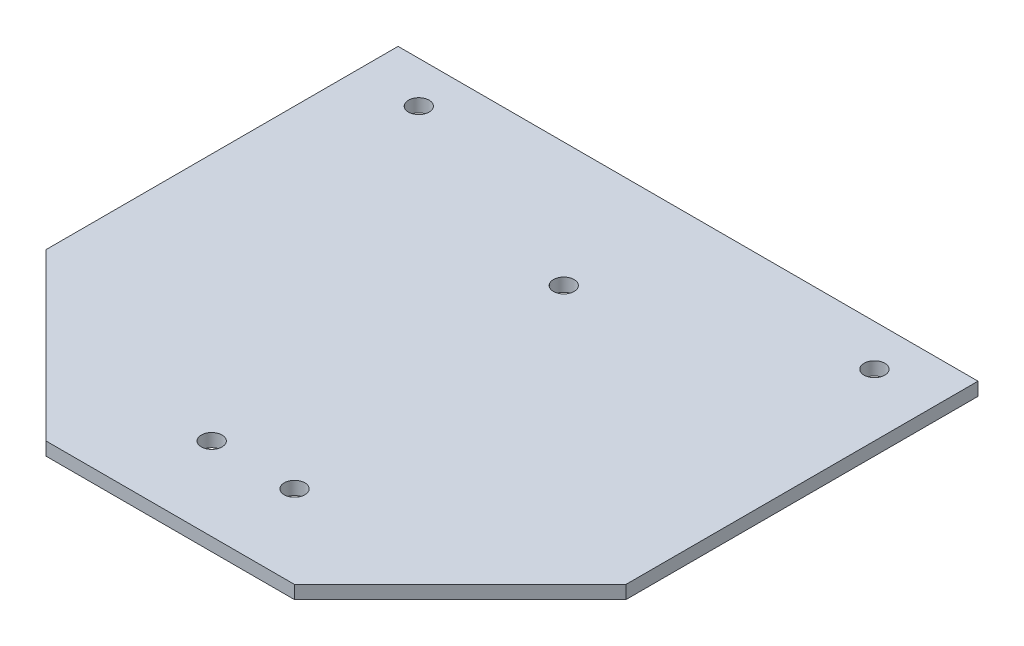
ISO-10303-21;
HEADER;
FILE_DESCRIPTION(('STEP AP214'),'2;1');
FILE_NAME('part.step','',(''),(''),'','','');
FILE_SCHEMA(('AUTOMOTIVE_DESIGN { 1 0 10303 214 1 1 1 1 }'));
ENDSEC;
DATA;
#1=APPLICATION_CONTEXT('core data for automotive mechanical design processes');
#2=APPLICATION_PROTOCOL_DEFINITION('international standard','automotive_design',2000,#1);
#3=PRODUCT_CONTEXT('',#1,'mechanical');
#4=PRODUCT('Part','Part','',(#3));
#5=PRODUCT_RELATED_PRODUCT_CATEGORY('part','',(#4));
#6=PRODUCT_DEFINITION_FORMATION('','',#4);
#7=PRODUCT_DEFINITION_CONTEXT('part definition',#1,'design');
#8=PRODUCT_DEFINITION('design','',#6,#7);
#9=PRODUCT_DEFINITION_SHAPE('','',#8);
#10=(LENGTH_UNIT() NAMED_UNIT(*) SI_UNIT(.MILLI.,.METRE.));
#11=(NAMED_UNIT(*) PLANE_ANGLE_UNIT() SI_UNIT($,.RADIAN.));
#12=(NAMED_UNIT(*) SI_UNIT($,.STERADIAN.) SOLID_ANGLE_UNIT());
#13=UNCERTAINTY_MEASURE_WITH_UNIT(LENGTH_MEASURE(1.E-05),#10,'distance_accuracy_value','');
#14=(GEOMETRIC_REPRESENTATION_CONTEXT(3) GLOBAL_UNCERTAINTY_ASSIGNED_CONTEXT((#13)) GLOBAL_UNIT_ASSIGNED_CONTEXT((#10,
#11,#12)) REPRESENTATION_CONTEXT('',''));
#15=CARTESIAN_POINT('',(0.,0.,0.));
#16=DIRECTION('',(0.,0.,1.));
#17=DIRECTION('',(1.,0.,0.));
#18=AXIS2_PLACEMENT_3D('',#15,#16,#17);
#19=CARTESIAN_POINT('',(0.,3.18,0.));
#20=DIRECTION('',(0.,-1.,0.));
#21=DIRECTION('',(0.,0.,-1.));
#22=AXIS2_PLACEMENT_3D('',#19,#20,#21);
#23=PLANE('',#22);
#24=CARTESIAN_POINT('',(10.,3.18,-20.));
#25=DIRECTION('',(0.,1.,0.));
#26=DIRECTION('',(0.,0.,1.));
#27=AXIS2_PLACEMENT_3D('',#24,#25,#26);
#28=CIRCLE('',#27,2.5);
#29=CARTESIAN_POINT('',(10.,3.18,-22.5));
#30=VERTEX_POINT('',#29);
#31=EDGE_CURVE('E151',#30,#30,#28,.T.);
#32=ORIENTED_EDGE('',*,*,#31,.F.);
#33=EDGE_LOOP('',(#32));
#34=FACE_BOUND('',#33,.T.);
#35=CARTESIAN_POINT('',(75.,3.18,-115.));
#36=DIRECTION('',(0.,1.,0.));
#37=DIRECTION('',(0.,0.,1.));
#38=AXIS2_PLACEMENT_3D('',#35,#36,#37);
#39=CIRCLE('',#38,2.5);
#40=CARTESIAN_POINT('',(75.,3.18,-117.5));
#41=VERTEX_POINT('',#40);
#42=EDGE_CURVE('E163',#41,#41,#39,.T.);
#43=ORIENTED_EDGE('',*,*,#42,.F.);
#44=EDGE_LOOP('',(#43));
#45=FACE_BOUND('',#44,.T.);
#46=DIRECTION('',(0.,0.,1.));
#47=VECTOR('',#46,1.);
#48=CARTESIAN_POINT('',(-50.,3.18,-125.));
#49=LINE('',#48,#47);
#50=CARTESIAN_POINT('',(-50.,3.18,-125.));
#51=VERTEX_POINT('',#50);
#52=CARTESIAN_POINT('',(-50.,3.18,-40.));
#53=VERTEX_POINT('',#52);
#54=EDGE_CURVE('E100',#51,#53,#49,.T.);
#55=ORIENTED_EDGE('',*,*,#54,.T.);
#56=DIRECTION('',(0.707106781186547,0.,0.707106781186547));
#57=VECTOR('',#56,1.);
#58=CARTESIAN_POINT('',(-9.99999999999999,3.18,0.));
#59=LINE('',#58,#57);
#60=CARTESIAN_POINT('',(-9.99999999999999,3.18,0.));
#61=VERTEX_POINT('',#60);
#62=EDGE_CURVE('E47',#53,#61,#59,.T.);
#63=ORIENTED_EDGE('',*,*,#62,.T.);
#64=DIRECTION('',(1.,0.,0.));
#65=VECTOR('',#64,1.);
#66=CARTESIAN_POINT('',(-50.,3.18,0.));
#67=LINE('',#66,#65);
#68=CARTESIAN_POINT('',(50.,3.18,0.));
#69=VERTEX_POINT('',#68);
#70=EDGE_CURVE('E97',#61,#69,#67,.T.);
#71=ORIENTED_EDGE('',*,*,#70,.T.);
#72=DIRECTION('',(0.707106781186547,0.,-0.707106781186548));
#73=VECTOR('',#72,1.);
#74=CARTESIAN_POINT('',(90.,3.18,-40.));
#75=LINE('',#74,#73);
#76=CARTESIAN_POINT('',(90.,3.18,-40.));
#77=VERTEX_POINT('',#76);
#78=EDGE_CURVE('E138',#69,#77,#75,.T.);
#79=ORIENTED_EDGE('',*,*,#78,.T.);
#80=DIRECTION('',(0.,0.,-1.));
#81=VECTOR('',#80,1.);
#82=CARTESIAN_POINT('',(90.,3.18,-40.));
#83=LINE('',#82,#81);
#84=CARTESIAN_POINT('',(90.,3.18,-125.));
#85=VERTEX_POINT('',#84);
#86=EDGE_CURVE('E104',#77,#85,#83,.T.);
#87=ORIENTED_EDGE('',*,*,#86,.T.);
#88=DIRECTION('',(-1.,0.,0.));
#89=VECTOR('',#88,1.);
#90=CARTESIAN_POINT('',(90.,3.18,-125.));
#91=LINE('',#90,#89);
#92=EDGE_CURVE('E107',#85,#51,#91,.T.);
#93=ORIENTED_EDGE('',*,*,#92,.T.);
#94=EDGE_LOOP('',(#55,#63,#71,#79,#87,#93));
#95=FACE_BOUND('',#94,.T.);
#96=CARTESIAN_POINT('',(-35.,3.18,-115.));
#97=DIRECTION('',(0.,1.,0.));
#98=DIRECTION('',(0.,0.,1.));
#99=AXIS2_PLACEMENT_3D('',#96,#97,#98);
#100=CIRCLE('',#99,2.5);
#101=CARTESIAN_POINT('',(-35.,3.18,-117.5));
#102=VERTEX_POINT('',#101);
#103=EDGE_CURVE('E121',#102,#102,#100,.T.);
#104=ORIENTED_EDGE('',*,*,#103,.F.);
#105=EDGE_LOOP('',(#104));
#106=FACE_BOUND('',#105,.T.);
#107=CARTESIAN_POINT('',(20.,3.18,-95.));
#108=DIRECTION('',(0.,1.,0.));
#109=DIRECTION('',(0.,0.,1.));
#110=AXIS2_PLACEMENT_3D('',#107,#108,#109);
#111=CIRCLE('',#110,2.5);
#112=CARTESIAN_POINT('',(20.,3.18,-97.5));
#113=VERTEX_POINT('',#112);
#114=EDGE_CURVE('E157',#113,#113,#111,.T.);
#115=ORIENTED_EDGE('',*,*,#114,.F.);
#116=EDGE_LOOP('',(#115));
#117=FACE_BOUND('',#116,.T.);
#118=CARTESIAN_POINT('',(30.,3.18,-20.));
#119=DIRECTION('',(0.,1.,0.));
#120=DIRECTION('',(0.,0.,1.));
#121=AXIS2_PLACEMENT_3D('',#118,#119,#120);
#122=CIRCLE('',#121,2.5);
#123=CARTESIAN_POINT('',(30.,3.18,-22.5));
#124=VERTEX_POINT('',#123);
#125=EDGE_CURVE('E145',#124,#124,#122,.T.);
#126=ORIENTED_EDGE('',*,*,#125,.F.);
#127=EDGE_LOOP('',(#126));
#128=FACE_BOUND('',#127,.T.);
#129=ADVANCED_FACE('F32',(#34,#45,#95,#106,#117,#128),#23,.F.);
#130=CARTESIAN_POINT('',(0.,0.,0.));
#131=DIRECTION('',(0.,-1.,0.));
#132=DIRECTION('',(0.,0.,-1.));
#133=AXIS2_PLACEMENT_3D('',#130,#131,#132);
#134=PLANE('',#133);
#135=DIRECTION('',(0.707106781186547,0.,0.707106781186547));
#136=VECTOR('',#135,1.);
#137=CARTESIAN_POINT('',(-9.99999999999999,0.,0.));
#138=LINE('',#137,#136);
#139=CARTESIAN_POINT('',(-50.,0.,-40.));
#140=VERTEX_POINT('',#139);
#141=CARTESIAN_POINT('',(-9.99999999999999,0.,0.));
#142=VERTEX_POINT('',#141);
#143=EDGE_CURVE('E87',#140,#142,#138,.T.);
#144=ORIENTED_EDGE('',*,*,#143,.F.);
#145=DIRECTION('',(0.,0.,1.));
#146=VECTOR('',#145,1.);
#147=CARTESIAN_POINT('',(-50.,0.,-125.));
#148=LINE('',#147,#146);
#149=CARTESIAN_POINT('',(-50.,0.,-125.));
#150=VERTEX_POINT('',#149);
#151=EDGE_CURVE('E105',#150,#140,#148,.T.);
#152=ORIENTED_EDGE('',*,*,#151,.F.);
#153=DIRECTION('',(-1.,0.,0.));
#154=VECTOR('',#153,1.);
#155=CARTESIAN_POINT('',(90.,0.,-125.));
#156=LINE('',#155,#154);
#157=CARTESIAN_POINT('',(90.,0.,-125.));
#158=VERTEX_POINT('',#157);
#159=EDGE_CURVE('E110',#158,#150,#156,.T.);
#160=ORIENTED_EDGE('',*,*,#159,.F.);
#161=DIRECTION('',(0.,0.,-1.));
#162=VECTOR('',#161,1.);
#163=CARTESIAN_POINT('',(90.,0.,-125.));
#164=LINE('',#163,#162);
#165=CARTESIAN_POINT('',(90.,0.,-40.));
#166=VERTEX_POINT('',#165);
#167=EDGE_CURVE('E120',#166,#158,#164,.T.);
#168=ORIENTED_EDGE('',*,*,#167,.F.);
#169=DIRECTION('',(0.707106781186547,0.,-0.707106781186548));
#170=VECTOR('',#169,1.);
#171=CARTESIAN_POINT('',(90.,0.,-40.));
#172=LINE('',#171,#170);
#173=CARTESIAN_POINT('',(50.,0.,0.));
#174=VERTEX_POINT('',#173);
#175=EDGE_CURVE('E55',#174,#166,#172,.T.);
#176=ORIENTED_EDGE('',*,*,#175,.F.);
#177=DIRECTION('',(1.,0.,0.));
#178=VECTOR('',#177,1.);
#179=CARTESIAN_POINT('',(40.,0.,0.));
#180=LINE('',#179,#178);
#181=EDGE_CURVE('E118',#142,#174,#180,.T.);
#182=ORIENTED_EDGE('',*,*,#181,.F.);
#183=EDGE_LOOP('',(#144,#152,#160,#168,#176,#182));
#184=FACE_BOUND('',#183,.T.);
#185=CARTESIAN_POINT('',(10.,0.,-20.));
#186=DIRECTION('',(0.,1.,0.));
#187=DIRECTION('',(0.,0.,1.));
#188=AXIS2_PLACEMENT_3D('',#185,#186,#187);
#189=CIRCLE('',#188,2.5);
#190=CARTESIAN_POINT('',(10.,0.,-22.5));
#191=VERTEX_POINT('',#190);
#192=EDGE_CURVE('E148',#191,#191,#189,.T.);
#193=ORIENTED_EDGE('',*,*,#192,.T.);
#194=EDGE_LOOP('',(#193));
#195=FACE_BOUND('',#194,.T.);
#196=CARTESIAN_POINT('',(75.,0.,-115.));
#197=DIRECTION('',(0.,1.,0.));
#198=DIRECTION('',(0.,0.,1.));
#199=AXIS2_PLACEMENT_3D('',#196,#197,#198);
#200=CIRCLE('',#199,2.5);
#201=CARTESIAN_POINT('',(75.,0.,-117.5));
#202=VERTEX_POINT('',#201);
#203=EDGE_CURVE('E160',#202,#202,#200,.T.);
#204=ORIENTED_EDGE('',*,*,#203,.T.);
#205=EDGE_LOOP('',(#204));
#206=FACE_BOUND('',#205,.T.);
#207=CARTESIAN_POINT('',(-35.,0.,-115.));
#208=DIRECTION('',(0.,1.,0.));
#209=DIRECTION('',(0.,0.,1.));
#210=AXIS2_PLACEMENT_3D('',#207,#208,#209);
#211=CIRCLE('',#210,2.5);
#212=CARTESIAN_POINT('',(-35.,0.,-117.5));
#213=VERTEX_POINT('',#212);
#214=EDGE_CURVE('E113',#213,#213,#211,.T.);
#215=ORIENTED_EDGE('',*,*,#214,.T.);
#216=EDGE_LOOP('',(#215));
#217=FACE_BOUND('',#216,.T.);
#218=CARTESIAN_POINT('',(20.,0.,-95.));
#219=DIRECTION('',(0.,1.,0.));
#220=DIRECTION('',(0.,0.,1.));
#221=AXIS2_PLACEMENT_3D('',#218,#219,#220);
#222=CIRCLE('',#221,2.5);
#223=CARTESIAN_POINT('',(20.,0.,-97.5));
#224=VERTEX_POINT('',#223);
#225=EDGE_CURVE('E154',#224,#224,#222,.T.);
#226=ORIENTED_EDGE('',*,*,#225,.T.);
#227=EDGE_LOOP('',(#226));
#228=FACE_BOUND('',#227,.T.);
#229=CARTESIAN_POINT('',(30.,0.,-20.));
#230=DIRECTION('',(0.,1.,0.));
#231=DIRECTION('',(0.,0.,1.));
#232=AXIS2_PLACEMENT_3D('',#229,#230,#231);
#233=CIRCLE('',#232,2.5);
#234=CARTESIAN_POINT('',(30.,0.,-22.5));
#235=VERTEX_POINT('',#234);
#236=EDGE_CURVE('E143',#235,#235,#233,.T.);
#237=ORIENTED_EDGE('',*,*,#236,.T.);
#238=EDGE_LOOP('',(#237));
#239=FACE_BOUND('',#238,.T.);
#240=ADVANCED_FACE('F132',(#184,#195,#206,#217,#228,#239),#134,.T.);
#241=CARTESIAN_POINT('',(40.,3.18,0.));
#242=DIRECTION('',(0.,0.,-1.));
#243=DIRECTION('',(-1.,0.,0.));
#244=AXIS2_PLACEMENT_3D('',#241,#242,#243);
#245=PLANE('',#244);
#246=ORIENTED_EDGE('',*,*,#70,.F.);
#247=DIRECTION('',(0.,-1.,0.));
#248=VECTOR('',#247,1.);
#249=CARTESIAN_POINT('',(-9.99999999999999,3.18,0.));
#250=LINE('',#249,#248);
#251=EDGE_CURVE('E84',#61,#142,#250,.T.);
#252=ORIENTED_EDGE('',*,*,#251,.T.);
#253=ORIENTED_EDGE('',*,*,#181,.T.);
#254=DIRECTION('',(0.,-1.,0.));
#255=VECTOR('',#254,1.);
#256=CARTESIAN_POINT('',(50.,3.18,0.));
#257=LINE('',#256,#255);
#258=EDGE_CURVE('E103',#69,#174,#257,.T.);
#259=ORIENTED_EDGE('',*,*,#258,.F.);
#260=EDGE_LOOP('',(#246,#252,#253,#259));
#261=FACE_BOUND('',#260,.T.);
#262=ADVANCED_FACE('F34',(#261),#245,.F.);
#263=CARTESIAN_POINT('',(90.,3.18,-125.));
#264=DIRECTION('',(-1.,0.,0.));
#265=DIRECTION('',(0.,0.,1.));
#266=AXIS2_PLACEMENT_3D('',#263,#264,#265);
#267=PLANE('',#266);
#268=ORIENTED_EDGE('',*,*,#86,.F.);
#269=DIRECTION('',(0.,-1.,0.));
#270=VECTOR('',#269,1.);
#271=CARTESIAN_POINT('',(90.,3.18,-40.));
#272=LINE('',#271,#270);
#273=EDGE_CURVE('E141',#77,#166,#272,.T.);
#274=ORIENTED_EDGE('',*,*,#273,.T.);
#275=ORIENTED_EDGE('',*,*,#167,.T.);
#276=DIRECTION('',(0.,-1.,0.));
#277=VECTOR('',#276,1.);
#278=CARTESIAN_POINT('',(90.,3.18,-125.));
#279=LINE('',#278,#277);
#280=EDGE_CURVE('E11',#85,#158,#279,.T.);
#281=ORIENTED_EDGE('',*,*,#280,.F.);
#282=EDGE_LOOP('',(#268,#274,#275,#281));
#283=FACE_BOUND('',#282,.T.);
#284=ADVANCED_FACE('F199',(#283),#267,.F.);
#285=CARTESIAN_POINT('',(90.,3.18,-125.));
#286=DIRECTION('',(0.,0.,1.));
#287=DIRECTION('',(1.,0.,0.));
#288=AXIS2_PLACEMENT_3D('',#285,#286,#287);
#289=PLANE('',#288);
#290=ORIENTED_EDGE('',*,*,#159,.T.);
#291=DIRECTION('',(0.,-1.,0.));
#292=VECTOR('',#291,1.);
#293=CARTESIAN_POINT('',(-50.,3.18,-125.));
#294=LINE('',#293,#292);
#295=EDGE_CURVE('E40',#51,#150,#294,.T.);
#296=ORIENTED_EDGE('',*,*,#295,.F.);
#297=ORIENTED_EDGE('',*,*,#92,.F.);
#298=ORIENTED_EDGE('',*,*,#280,.T.);
#299=EDGE_LOOP('',(#290,#296,#297,#298));
#300=FACE_BOUND('',#299,.T.);
#301=ADVANCED_FACE('F186',(#300),#289,.F.);
#302=CARTESIAN_POINT('',(-50.,3.18,-125.));
#303=DIRECTION('',(1.,0.,0.));
#304=DIRECTION('',(0.,0.,-1.));
#305=AXIS2_PLACEMENT_3D('',#302,#303,#304);
#306=PLANE('',#305);
#307=ORIENTED_EDGE('',*,*,#151,.T.);
#308=DIRECTION('',(0.,-1.,0.));
#309=VECTOR('',#308,1.);
#310=CARTESIAN_POINT('',(-50.,3.18,-40.));
#311=LINE('',#310,#309);
#312=EDGE_CURVE('E91',#53,#140,#311,.T.);
#313=ORIENTED_EDGE('',*,*,#312,.F.);
#314=ORIENTED_EDGE('',*,*,#54,.F.);
#315=ORIENTED_EDGE('',*,*,#295,.T.);
#316=EDGE_LOOP('',(#307,#313,#314,#315));
#317=FACE_BOUND('',#316,.T.);
#318=ADVANCED_FACE('F127',(#317),#306,.F.);
#319=CARTESIAN_POINT('',(-35.,3.18,-115.));
#320=DIRECTION('',(0.,-1.,0.));
#321=DIRECTION('',(0.,0.,-1.));
#322=AXIS2_PLACEMENT_3D('',#319,#320,#321);
#323=CYLINDRICAL_SURFACE('',#322,2.5);
#324=CARTESIAN_POINT('',(-35.,3.18,-117.5));
#325=CARTESIAN_POINT('',(-35.,3.146875,-117.5));
#326=CARTESIAN_POINT('',(-35.,3.11375,-117.5));
#327=CARTESIAN_POINT('',(-35.,3.0475,-117.5));
#328=CARTESIAN_POINT('',(-35.,3.014375,-117.5));
#329=CARTESIAN_POINT('',(-35.,2.948125,-117.5));
#330=CARTESIAN_POINT('',(-35.,2.915,-117.5));
#331=CARTESIAN_POINT('',(-35.,2.84875,-117.5));
#332=CARTESIAN_POINT('',(-35.,2.815625,-117.5));
#333=CARTESIAN_POINT('',(-35.,2.749375,-117.5));
#334=CARTESIAN_POINT('',(-35.,2.71625,-117.5));
#335=CARTESIAN_POINT('',(-35.,2.65,-117.5));
#336=CARTESIAN_POINT('',(-35.,2.616875,-117.5));
#337=CARTESIAN_POINT('',(-35.,2.550625,-117.5));
#338=CARTESIAN_POINT('',(-35.,2.5175,-117.5));
#339=CARTESIAN_POINT('',(-35.,2.45125,-117.5));
#340=CARTESIAN_POINT('',(-35.,2.418125,-117.5));
#341=CARTESIAN_POINT('',(-35.,2.351875,-117.5));
#342=CARTESIAN_POINT('',(-35.,2.31875,-117.5));
#343=CARTESIAN_POINT('',(-35.,2.2525,-117.5));
#344=CARTESIAN_POINT('',(-35.,2.219375,-117.5));
#345=CARTESIAN_POINT('',(-35.,2.153125,-117.5));
#346=CARTESIAN_POINT('',(-35.,2.12,-117.5));
#347=CARTESIAN_POINT('',(-35.,2.05375,-117.5));
#348=CARTESIAN_POINT('',(-35.,2.020625,-117.5));
#349=CARTESIAN_POINT('',(-35.,1.954375,-117.5));
#350=CARTESIAN_POINT('',(-35.,1.92125,-117.5));
#351=CARTESIAN_POINT('',(-35.,1.855,-117.5));
#352=CARTESIAN_POINT('',(-35.,1.821875,-117.5));
#353=CARTESIAN_POINT('',(-35.,1.755625,-117.5));
#354=CARTESIAN_POINT('',(-35.,1.7225,-117.5));
#355=CARTESIAN_POINT('',(-35.,1.65625,-117.5));
#356=CARTESIAN_POINT('',(-35.,1.623125,-117.5));
#357=CARTESIAN_POINT('',(-35.,1.556875,-117.5));
#358=CARTESIAN_POINT('',(-35.,1.52375,-117.5));
#359=CARTESIAN_POINT('',(-35.,1.4575,-117.5));
#360=CARTESIAN_POINT('',(-35.,1.424375,-117.5));
#361=CARTESIAN_POINT('',(-35.,1.358125,-117.5));
#362=CARTESIAN_POINT('',(-35.,1.325,-117.5));
#363=CARTESIAN_POINT('',(-35.,1.25875,-117.5));
#364=CARTESIAN_POINT('',(-35.,1.225625,-117.5));
#365=CARTESIAN_POINT('',(-35.,1.159375,-117.5));
#366=CARTESIAN_POINT('',(-35.,1.12625,-117.5));
#367=CARTESIAN_POINT('',(-35.,1.06,-117.5));
#368=CARTESIAN_POINT('',(-35.,1.026875,-117.5));
#369=CARTESIAN_POINT('',(-35.,0.960625,-117.5));
#370=CARTESIAN_POINT('',(-35.,0.9275,-117.5));
#371=CARTESIAN_POINT('',(-35.,0.86125,-117.5));
#372=CARTESIAN_POINT('',(-35.,0.828125,-117.5));
#373=CARTESIAN_POINT('',(-35.,0.761875,-117.5));
#374=CARTESIAN_POINT('',(-35.,0.72875,-117.5));
#375=CARTESIAN_POINT('',(-35.,0.6625,-117.5));
#376=CARTESIAN_POINT('',(-35.,0.629375,-117.5));
#377=CARTESIAN_POINT('',(-35.,0.563125,-117.5));
#378=CARTESIAN_POINT('',(-35.,0.53,-117.5));
#379=CARTESIAN_POINT('',(-35.,0.46375,-117.5));
#380=CARTESIAN_POINT('',(-35.,0.430625,-117.5));
#381=CARTESIAN_POINT('',(-35.,0.364375,-117.5));
#382=CARTESIAN_POINT('',(-35.,0.33125,-117.5));
#383=CARTESIAN_POINT('',(-35.,0.265,-117.5));
#384=CARTESIAN_POINT('',(-35.,0.231875,-117.5));
#385=CARTESIAN_POINT('',(-35.,0.165625,-117.5));
#386=CARTESIAN_POINT('',(-35.,0.1325,-117.5));
#387=CARTESIAN_POINT('',(-35.,0.06625,-117.5));
#388=CARTESIAN_POINT('',(-35.,0.033125,-117.5));
#389=CARTESIAN_POINT('',(-35.,0.,-117.5));
#390=B_SPLINE_CURVE_WITH_KNOTS('',3,(#324,#325,#326,#327,#328,#329,#330,#331,#332,#333,#334,
#335,#336,#337,#338,#339,#340,#341,#342,#343,#344,#345,#346,#347,#348,#349,#350,#351,#352,#353,
#354,#355,#356,#357,#358,#359,#360,#361,#362,#363,#364,#365,#366,#367,#368,#369,#370,#371,#372,
#373,#374,#375,#376,#377,#378,#379,#380,#381,#382,#383,#384,#385,#386,#387,#388,#389),
.UNSPECIFIED.,.F.,.F.,(4,2,2,2,2,2,2,2,2,2,2,2,2,2,2,2,2,2,2,2,2,2,2,2,2,2,2,2,2,2,2,2,4),(0.,
0.0993750000000001,0.19875,0.298125,0.3975,0.496875,0.59625,0.695625,0.795,0.894375,0.99375,
1.093125,1.1925,1.291875,1.39125,1.490625,1.59,1.689375,1.78875,1.888125,1.9875,2.086875,
2.18625,2.285625,2.385,2.484375,2.58375,2.683125,2.7825,2.881875,2.98125,3.080625,3.18),.UNSPECIFIED.);
#391=EDGE_CURVE('BSEAM175',#102,#213,#390,.T.);
#392=ORIENTED_EDGE('',*,*,#103,.T.);
#393=ORIENTED_EDGE('',*,*,#214,.F.);
#394=ORIENTED_EDGE('',*,*,#391,.T.);
#395=ORIENTED_EDGE('',*,*,#391,.F.);
#396=EDGE_LOOP('',(#392,#394,#393,#395));
#397=FACE_BOUND('',#396,.T.);
#398=ADVANCED_FACE('F175',(#397),#323,.F.);
#399=CARTESIAN_POINT('',(75.,3.18,-115.));
#400=DIRECTION('',(0.,-1.,0.));
#401=DIRECTION('',(0.,0.,-1.));
#402=AXIS2_PLACEMENT_3D('',#399,#400,#401);
#403=CYLINDRICAL_SURFACE('',#402,2.5);
#404=CARTESIAN_POINT('',(75.,3.18,-117.5));
#405=CARTESIAN_POINT('',(75.,3.146875,-117.5));
#406=CARTESIAN_POINT('',(75.,3.11375,-117.5));
#407=CARTESIAN_POINT('',(75.,3.0475,-117.5));
#408=CARTESIAN_POINT('',(75.,3.014375,-117.5));
#409=CARTESIAN_POINT('',(75.,2.948125,-117.5));
#410=CARTESIAN_POINT('',(75.,2.915,-117.5));
#411=CARTESIAN_POINT('',(75.,2.84875,-117.5));
#412=CARTESIAN_POINT('',(75.,2.815625,-117.5));
#413=CARTESIAN_POINT('',(75.,2.749375,-117.5));
#414=CARTESIAN_POINT('',(75.,2.71625,-117.5));
#415=CARTESIAN_POINT('',(75.,2.65,-117.5));
#416=CARTESIAN_POINT('',(75.,2.616875,-117.5));
#417=CARTESIAN_POINT('',(75.,2.550625,-117.5));
#418=CARTESIAN_POINT('',(75.,2.5175,-117.5));
#419=CARTESIAN_POINT('',(75.,2.45125,-117.5));
#420=CARTESIAN_POINT('',(75.,2.418125,-117.5));
#421=CARTESIAN_POINT('',(75.,2.351875,-117.5));
#422=CARTESIAN_POINT('',(75.,2.31875,-117.5));
#423=CARTESIAN_POINT('',(75.,2.2525,-117.5));
#424=CARTESIAN_POINT('',(75.,2.219375,-117.5));
#425=CARTESIAN_POINT('',(75.,2.153125,-117.5));
#426=CARTESIAN_POINT('',(75.,2.12,-117.5));
#427=CARTESIAN_POINT('',(75.,2.05375,-117.5));
#428=CARTESIAN_POINT('',(75.,2.020625,-117.5));
#429=CARTESIAN_POINT('',(75.,1.954375,-117.5));
#430=CARTESIAN_POINT('',(75.,1.92125,-117.5));
#431=CARTESIAN_POINT('',(75.,1.855,-117.5));
#432=CARTESIAN_POINT('',(75.,1.821875,-117.5));
#433=CARTESIAN_POINT('',(75.,1.755625,-117.5));
#434=CARTESIAN_POINT('',(75.,1.7225,-117.5));
#435=CARTESIAN_POINT('',(75.,1.65625,-117.5));
#436=CARTESIAN_POINT('',(75.,1.623125,-117.5));
#437=CARTESIAN_POINT('',(75.,1.556875,-117.5));
#438=CARTESIAN_POINT('',(75.,1.52375,-117.5));
#439=CARTESIAN_POINT('',(75.,1.4575,-117.5));
#440=CARTESIAN_POINT('',(75.,1.424375,-117.5));
#441=CARTESIAN_POINT('',(75.,1.358125,-117.5));
#442=CARTESIAN_POINT('',(75.,1.325,-117.5));
#443=CARTESIAN_POINT('',(75.,1.25875,-117.5));
#444=CARTESIAN_POINT('',(75.,1.225625,-117.5));
#445=CARTESIAN_POINT('',(75.,1.159375,-117.5));
#446=CARTESIAN_POINT('',(75.,1.12625,-117.5));
#447=CARTESIAN_POINT('',(75.,1.06,-117.5));
#448=CARTESIAN_POINT('',(75.,1.026875,-117.5));
#449=CARTESIAN_POINT('',(75.,0.960625,-117.5));
#450=CARTESIAN_POINT('',(75.,0.9275,-117.5));
#451=CARTESIAN_POINT('',(75.,0.86125,-117.5));
#452=CARTESIAN_POINT('',(75.,0.828125,-117.5));
#453=CARTESIAN_POINT('',(75.,0.761875,-117.5));
#454=CARTESIAN_POINT('',(75.,0.72875,-117.5));
#455=CARTESIAN_POINT('',(75.,0.6625,-117.5));
#456=CARTESIAN_POINT('',(75.,0.629375,-117.5));
#457=CARTESIAN_POINT('',(75.,0.563125,-117.5));
#458=CARTESIAN_POINT('',(75.,0.53,-117.5));
#459=CARTESIAN_POINT('',(75.,0.46375,-117.5));
#460=CARTESIAN_POINT('',(75.,0.430625,-117.5));
#461=CARTESIAN_POINT('',(75.,0.364375,-117.5));
#462=CARTESIAN_POINT('',(75.,0.33125,-117.5));
#463=CARTESIAN_POINT('',(75.,0.265,-117.5));
#464=CARTESIAN_POINT('',(75.,0.231875,-117.5));
#465=CARTESIAN_POINT('',(75.,0.165625,-117.5));
#466=CARTESIAN_POINT('',(75.,0.1325,-117.5));
#467=CARTESIAN_POINT('',(75.,0.06625,-117.5));
#468=CARTESIAN_POINT('',(75.,0.033125,-117.5));
#469=CARTESIAN_POINT('',(75.,0.,-117.5));
#470=B_SPLINE_CURVE_WITH_KNOTS('',3,(#404,#405,#406,#407,#408,#409,#410,#411,#412,#413,#414,
#415,#416,#417,#418,#419,#420,#421,#422,#423,#424,#425,#426,#427,#428,#429,#430,#431,#432,#433,
#434,#435,#436,#437,#438,#439,#440,#441,#442,#443,#444,#445,#446,#447,#448,#449,#450,#451,#452,
#453,#454,#455,#456,#457,#458,#459,#460,#461,#462,#463,#464,#465,#466,#467,#468,#469),
.UNSPECIFIED.,.F.,.F.,(4,2,2,2,2,2,2,2,2,2,2,2,2,2,2,2,2,2,2,2,2,2,2,2,2,2,2,2,2,2,2,2,4),(0.,
0.0993750000000001,0.19875,0.298125,0.3975,0.496875,0.59625,0.695625,0.795,0.894375,0.99375,
1.093125,1.1925,1.291875,1.39125,1.490625,1.59,1.689375,1.78875,1.888125,1.9875,2.086875,
2.18625,2.285625,2.385,2.484375,2.58375,2.683125,2.7825,2.881875,2.98125,3.080625,3.18),.UNSPECIFIED.);
#471=EDGE_CURVE('BSEAM177',#41,#202,#470,.T.);
#472=ORIENTED_EDGE('',*,*,#42,.T.);
#473=ORIENTED_EDGE('',*,*,#203,.F.);
#474=ORIENTED_EDGE('',*,*,#471,.T.);
#475=ORIENTED_EDGE('',*,*,#471,.F.);
#476=EDGE_LOOP('',(#472,#474,#473,#475));
#477=FACE_BOUND('',#476,.T.);
#478=ADVANCED_FACE('F177',(#477),#403,.F.);
#479=CARTESIAN_POINT('',(20.,3.18,-95.));
#480=DIRECTION('',(0.,-1.,0.));
#481=DIRECTION('',(0.,0.,-1.));
#482=AXIS2_PLACEMENT_3D('',#479,#480,#481);
#483=CYLINDRICAL_SURFACE('',#482,2.5);
#484=CARTESIAN_POINT('',(20.,3.18,-97.5));
#485=CARTESIAN_POINT('',(20.,3.146875,-97.5));
#486=CARTESIAN_POINT('',(20.,3.11375,-97.5));
#487=CARTESIAN_POINT('',(20.,3.0475,-97.5));
#488=CARTESIAN_POINT('',(20.,3.014375,-97.5));
#489=CARTESIAN_POINT('',(20.,2.948125,-97.5));
#490=CARTESIAN_POINT('',(20.,2.915,-97.5));
#491=CARTESIAN_POINT('',(20.,2.84875,-97.5));
#492=CARTESIAN_POINT('',(20.,2.815625,-97.5));
#493=CARTESIAN_POINT('',(20.,2.749375,-97.5));
#494=CARTESIAN_POINT('',(20.,2.71625,-97.5));
#495=CARTESIAN_POINT('',(20.,2.65,-97.5));
#496=CARTESIAN_POINT('',(20.,2.616875,-97.5));
#497=CARTESIAN_POINT('',(20.,2.550625,-97.5));
#498=CARTESIAN_POINT('',(20.,2.5175,-97.5));
#499=CARTESIAN_POINT('',(20.,2.45125,-97.5));
#500=CARTESIAN_POINT('',(20.,2.418125,-97.5));
#501=CARTESIAN_POINT('',(20.,2.351875,-97.5));
#502=CARTESIAN_POINT('',(20.,2.31875,-97.5));
#503=CARTESIAN_POINT('',(20.,2.2525,-97.5));
#504=CARTESIAN_POINT('',(20.,2.219375,-97.5));
#505=CARTESIAN_POINT('',(20.,2.153125,-97.5));
#506=CARTESIAN_POINT('',(20.,2.12,-97.5));
#507=CARTESIAN_POINT('',(20.,2.05375,-97.5));
#508=CARTESIAN_POINT('',(20.,2.020625,-97.5));
#509=CARTESIAN_POINT('',(20.,1.954375,-97.5));
#510=CARTESIAN_POINT('',(20.,1.92125,-97.5));
#511=CARTESIAN_POINT('',(20.,1.855,-97.5));
#512=CARTESIAN_POINT('',(20.,1.821875,-97.5));
#513=CARTESIAN_POINT('',(20.,1.755625,-97.5));
#514=CARTESIAN_POINT('',(20.,1.7225,-97.5));
#515=CARTESIAN_POINT('',(20.,1.65625,-97.5));
#516=CARTESIAN_POINT('',(20.,1.623125,-97.5));
#517=CARTESIAN_POINT('',(20.,1.556875,-97.5));
#518=CARTESIAN_POINT('',(20.,1.52375,-97.5));
#519=CARTESIAN_POINT('',(20.,1.4575,-97.5));
#520=CARTESIAN_POINT('',(20.,1.424375,-97.5));
#521=CARTESIAN_POINT('',(20.,1.358125,-97.5));
#522=CARTESIAN_POINT('',(20.,1.325,-97.5));
#523=CARTESIAN_POINT('',(20.,1.25875,-97.5));
#524=CARTESIAN_POINT('',(20.,1.225625,-97.5));
#525=CARTESIAN_POINT('',(20.,1.159375,-97.5));
#526=CARTESIAN_POINT('',(20.,1.12625,-97.5));
#527=CARTESIAN_POINT('',(20.,1.06,-97.5));
#528=CARTESIAN_POINT('',(20.,1.026875,-97.5));
#529=CARTESIAN_POINT('',(20.,0.960625,-97.5));
#530=CARTESIAN_POINT('',(20.,0.9275,-97.5));
#531=CARTESIAN_POINT('',(20.,0.86125,-97.5));
#532=CARTESIAN_POINT('',(20.,0.828125,-97.5));
#533=CARTESIAN_POINT('',(20.,0.761875,-97.5));
#534=CARTESIAN_POINT('',(20.,0.72875,-97.5));
#535=CARTESIAN_POINT('',(20.,0.6625,-97.5));
#536=CARTESIAN_POINT('',(20.,0.629375,-97.5));
#537=CARTESIAN_POINT('',(20.,0.563125,-97.5));
#538=CARTESIAN_POINT('',(20.,0.53,-97.5));
#539=CARTESIAN_POINT('',(20.,0.46375,-97.5));
#540=CARTESIAN_POINT('',(20.,0.430625,-97.5));
#541=CARTESIAN_POINT('',(20.,0.364375,-97.5));
#542=CARTESIAN_POINT('',(20.,0.33125,-97.5));
#543=CARTESIAN_POINT('',(20.,0.265,-97.5));
#544=CARTESIAN_POINT('',(20.,0.231875,-97.5));
#545=CARTESIAN_POINT('',(20.,0.165625,-97.5));
#546=CARTESIAN_POINT('',(20.,0.1325,-97.5));
#547=CARTESIAN_POINT('',(20.,0.06625,-97.5));
#548=CARTESIAN_POINT('',(20.,0.033125,-97.5));
#549=CARTESIAN_POINT('',(20.,0.,-97.5));
#550=B_SPLINE_CURVE_WITH_KNOTS('',3,(#484,#485,#486,#487,#488,#489,#490,#491,#492,#493,#494,
#495,#496,#497,#498,#499,#500,#501,#502,#503,#504,#505,#506,#507,#508,#509,#510,#511,#512,#513,
#514,#515,#516,#517,#518,#519,#520,#521,#522,#523,#524,#525,#526,#527,#528,#529,#530,#531,#532,
#533,#534,#535,#536,#537,#538,#539,#540,#541,#542,#543,#544,#545,#546,#547,#548,#549),
.UNSPECIFIED.,.F.,.F.,(4,2,2,2,2,2,2,2,2,2,2,2,2,2,2,2,2,2,2,2,2,2,2,2,2,2,2,2,2,2,2,2,4),(0.,
0.0993750000000001,0.19875,0.298125,0.3975,0.496875,0.59625,0.695625,0.795,0.894375,0.99375,
1.093125,1.1925,1.291875,1.39125,1.490625,1.59,1.689375,1.78875,1.888125,1.9875,2.086875,
2.18625,2.285625,2.385,2.484375,2.58375,2.683125,2.7825,2.881875,2.98125,3.080625,3.18),.UNSPECIFIED.);
#551=EDGE_CURVE('BSEAM183',#113,#224,#550,.T.);
#552=ORIENTED_EDGE('',*,*,#114,.T.);
#553=ORIENTED_EDGE('',*,*,#225,.F.);
#554=ORIENTED_EDGE('',*,*,#551,.T.);
#555=ORIENTED_EDGE('',*,*,#551,.F.);
#556=EDGE_LOOP('',(#552,#554,#553,#555));
#557=FACE_BOUND('',#556,.T.);
#558=ADVANCED_FACE('F183',(#557),#483,.F.);
#559=CARTESIAN_POINT('',(10.,3.18,-20.));
#560=DIRECTION('',(0.,-1.,0.));
#561=DIRECTION('',(0.,0.,-1.));
#562=AXIS2_PLACEMENT_3D('',#559,#560,#561);
#563=CYLINDRICAL_SURFACE('',#562,2.5);
#564=CARTESIAN_POINT('',(10.,3.18,-22.5));
#565=CARTESIAN_POINT('',(10.,3.146875,-22.5));
#566=CARTESIAN_POINT('',(10.,3.11375,-22.5));
#567=CARTESIAN_POINT('',(10.,3.0475,-22.5));
#568=CARTESIAN_POINT('',(10.,3.014375,-22.5));
#569=CARTESIAN_POINT('',(10.,2.948125,-22.5));
#570=CARTESIAN_POINT('',(10.,2.915,-22.5));
#571=CARTESIAN_POINT('',(10.,2.84875,-22.5));
#572=CARTESIAN_POINT('',(10.,2.815625,-22.5));
#573=CARTESIAN_POINT('',(10.,2.749375,-22.5));
#574=CARTESIAN_POINT('',(10.,2.71625,-22.5));
#575=CARTESIAN_POINT('',(10.,2.65,-22.5));
#576=CARTESIAN_POINT('',(10.,2.616875,-22.5));
#577=CARTESIAN_POINT('',(10.,2.550625,-22.5));
#578=CARTESIAN_POINT('',(10.,2.5175,-22.5));
#579=CARTESIAN_POINT('',(10.,2.45125,-22.5));
#580=CARTESIAN_POINT('',(10.,2.418125,-22.5));
#581=CARTESIAN_POINT('',(10.,2.351875,-22.5));
#582=CARTESIAN_POINT('',(10.,2.31875,-22.5));
#583=CARTESIAN_POINT('',(10.,2.2525,-22.5));
#584=CARTESIAN_POINT('',(10.,2.219375,-22.5));
#585=CARTESIAN_POINT('',(10.,2.153125,-22.5));
#586=CARTESIAN_POINT('',(10.,2.12,-22.5));
#587=CARTESIAN_POINT('',(10.,2.05375,-22.5));
#588=CARTESIAN_POINT('',(10.,2.020625,-22.5));
#589=CARTESIAN_POINT('',(10.,1.954375,-22.5));
#590=CARTESIAN_POINT('',(10.,1.92125,-22.5));
#591=CARTESIAN_POINT('',(10.,1.855,-22.5));
#592=CARTESIAN_POINT('',(10.,1.821875,-22.5));
#593=CARTESIAN_POINT('',(10.,1.755625,-22.5));
#594=CARTESIAN_POINT('',(10.,1.7225,-22.5));
#595=CARTESIAN_POINT('',(10.,1.65625,-22.5));
#596=CARTESIAN_POINT('',(10.,1.623125,-22.5));
#597=CARTESIAN_POINT('',(10.,1.556875,-22.5));
#598=CARTESIAN_POINT('',(10.,1.52375,-22.5));
#599=CARTESIAN_POINT('',(10.,1.4575,-22.5));
#600=CARTESIAN_POINT('',(10.,1.424375,-22.5));
#601=CARTESIAN_POINT('',(10.,1.358125,-22.5));
#602=CARTESIAN_POINT('',(10.,1.325,-22.5));
#603=CARTESIAN_POINT('',(10.,1.25875,-22.5));
#604=CARTESIAN_POINT('',(10.,1.225625,-22.5));
#605=CARTESIAN_POINT('',(10.,1.159375,-22.5));
#606=CARTESIAN_POINT('',(10.,1.12625,-22.5));
#607=CARTESIAN_POINT('',(10.,1.06,-22.5));
#608=CARTESIAN_POINT('',(10.,1.026875,-22.5));
#609=CARTESIAN_POINT('',(10.,0.960625,-22.5));
#610=CARTESIAN_POINT('',(10.,0.9275,-22.5));
#611=CARTESIAN_POINT('',(10.,0.86125,-22.5));
#612=CARTESIAN_POINT('',(10.,0.828125,-22.5));
#613=CARTESIAN_POINT('',(10.,0.761875,-22.5));
#614=CARTESIAN_POINT('',(10.,0.72875,-22.5));
#615=CARTESIAN_POINT('',(10.,0.6625,-22.5));
#616=CARTESIAN_POINT('',(10.,0.629375,-22.5));
#617=CARTESIAN_POINT('',(10.,0.563125,-22.5));
#618=CARTESIAN_POINT('',(10.,0.53,-22.5));
#619=CARTESIAN_POINT('',(10.,0.46375,-22.5));
#620=CARTESIAN_POINT('',(10.,0.430625,-22.5));
#621=CARTESIAN_POINT('',(10.,0.364375,-22.5));
#622=CARTESIAN_POINT('',(10.,0.33125,-22.5));
#623=CARTESIAN_POINT('',(10.,0.265,-22.5));
#624=CARTESIAN_POINT('',(10.,0.231875,-22.5));
#625=CARTESIAN_POINT('',(10.,0.165625,-22.5));
#626=CARTESIAN_POINT('',(10.,0.1325,-22.5));
#627=CARTESIAN_POINT('',(10.,0.06625,-22.5));
#628=CARTESIAN_POINT('',(10.,0.033125,-22.5));
#629=CARTESIAN_POINT('',(10.,0.,-22.5));
#630=B_SPLINE_CURVE_WITH_KNOTS('',3,(#564,#565,#566,#567,#568,#569,#570,#571,#572,#573,#574,
#575,#576,#577,#578,#579,#580,#581,#582,#583,#584,#585,#586,#587,#588,#589,#590,#591,#592,#593,
#594,#595,#596,#597,#598,#599,#600,#601,#602,#603,#604,#605,#606,#607,#608,#609,#610,#611,#612,
#613,#614,#615,#616,#617,#618,#619,#620,#621,#622,#623,#624,#625,#626,#627,#628,#629),
.UNSPECIFIED.,.F.,.F.,(4,2,2,2,2,2,2,2,2,2,2,2,2,2,2,2,2,2,2,2,2,2,2,2,2,2,2,2,2,2,2,2,4),(0.,
0.0993750000000001,0.19875,0.298125,0.3975,0.496875,0.59625,0.695625,0.795,0.894375,0.99375,
1.093125,1.1925,1.291875,1.39125,1.490625,1.59,1.689375,1.78875,1.888125,1.9875,2.086875,
2.18625,2.285625,2.385,2.484375,2.58375,2.683125,2.7825,2.881875,2.98125,3.080625,3.18),.UNSPECIFIED.);
#631=EDGE_CURVE('BSEAM216',#30,#191,#630,.T.);
#632=ORIENTED_EDGE('',*,*,#31,.T.);
#633=ORIENTED_EDGE('',*,*,#192,.F.);
#634=ORIENTED_EDGE('',*,*,#631,.T.);
#635=ORIENTED_EDGE('',*,*,#631,.F.);
#636=EDGE_LOOP('',(#632,#634,#633,#635));
#637=FACE_BOUND('',#636,.T.);
#638=ADVANCED_FACE('F216',(#637),#563,.F.);
#639=CARTESIAN_POINT('',(30.,3.18,-20.));
#640=DIRECTION('',(0.,-1.,0.));
#641=DIRECTION('',(0.,0.,-1.));
#642=AXIS2_PLACEMENT_3D('',#639,#640,#641);
#643=CYLINDRICAL_SURFACE('',#642,2.5);
#644=CARTESIAN_POINT('',(30.,3.18,-22.5));
#645=CARTESIAN_POINT('',(30.,3.146875,-22.5));
#646=CARTESIAN_POINT('',(30.,3.11375,-22.5));
#647=CARTESIAN_POINT('',(30.,3.0475,-22.5));
#648=CARTESIAN_POINT('',(30.,3.014375,-22.5));
#649=CARTESIAN_POINT('',(30.,2.948125,-22.5));
#650=CARTESIAN_POINT('',(30.,2.915,-22.5));
#651=CARTESIAN_POINT('',(30.,2.84875,-22.5));
#652=CARTESIAN_POINT('',(30.,2.815625,-22.5));
#653=CARTESIAN_POINT('',(30.,2.749375,-22.5));
#654=CARTESIAN_POINT('',(30.,2.71625,-22.5));
#655=CARTESIAN_POINT('',(30.,2.65,-22.5));
#656=CARTESIAN_POINT('',(30.,2.616875,-22.5));
#657=CARTESIAN_POINT('',(30.,2.550625,-22.5));
#658=CARTESIAN_POINT('',(30.,2.5175,-22.5));
#659=CARTESIAN_POINT('',(30.,2.45125,-22.5));
#660=CARTESIAN_POINT('',(30.,2.418125,-22.5));
#661=CARTESIAN_POINT('',(30.,2.351875,-22.5));
#662=CARTESIAN_POINT('',(30.,2.31875,-22.5));
#663=CARTESIAN_POINT('',(30.,2.2525,-22.5));
#664=CARTESIAN_POINT('',(30.,2.219375,-22.5));
#665=CARTESIAN_POINT('',(30.,2.153125,-22.5));
#666=CARTESIAN_POINT('',(30.,2.12,-22.5));
#667=CARTESIAN_POINT('',(30.,2.05375,-22.5));
#668=CARTESIAN_POINT('',(30.,2.020625,-22.5));
#669=CARTESIAN_POINT('',(30.,1.954375,-22.5));
#670=CARTESIAN_POINT('',(30.,1.92125,-22.5));
#671=CARTESIAN_POINT('',(30.,1.855,-22.5));
#672=CARTESIAN_POINT('',(30.,1.821875,-22.5));
#673=CARTESIAN_POINT('',(30.,1.755625,-22.5));
#674=CARTESIAN_POINT('',(30.,1.7225,-22.5));
#675=CARTESIAN_POINT('',(30.,1.65625,-22.5));
#676=CARTESIAN_POINT('',(30.,1.623125,-22.5));
#677=CARTESIAN_POINT('',(30.,1.556875,-22.5));
#678=CARTESIAN_POINT('',(30.,1.52375,-22.5));
#679=CARTESIAN_POINT('',(30.,1.4575,-22.5));
#680=CARTESIAN_POINT('',(30.,1.424375,-22.5));
#681=CARTESIAN_POINT('',(30.,1.358125,-22.5));
#682=CARTESIAN_POINT('',(30.,1.325,-22.5));
#683=CARTESIAN_POINT('',(30.,1.25875,-22.5));
#684=CARTESIAN_POINT('',(30.,1.225625,-22.5));
#685=CARTESIAN_POINT('',(30.,1.159375,-22.5));
#686=CARTESIAN_POINT('',(30.,1.12625,-22.5));
#687=CARTESIAN_POINT('',(30.,1.06,-22.5));
#688=CARTESIAN_POINT('',(30.,1.026875,-22.5));
#689=CARTESIAN_POINT('',(30.,0.960625,-22.5));
#690=CARTESIAN_POINT('',(30.,0.9275,-22.5));
#691=CARTESIAN_POINT('',(30.,0.86125,-22.5));
#692=CARTESIAN_POINT('',(30.,0.828125,-22.5));
#693=CARTESIAN_POINT('',(30.,0.761875,-22.5));
#694=CARTESIAN_POINT('',(30.,0.72875,-22.5));
#695=CARTESIAN_POINT('',(30.,0.6625,-22.5));
#696=CARTESIAN_POINT('',(30.,0.629375,-22.5));
#697=CARTESIAN_POINT('',(30.,0.563125,-22.5));
#698=CARTESIAN_POINT('',(30.,0.53,-22.5));
#699=CARTESIAN_POINT('',(30.,0.46375,-22.5));
#700=CARTESIAN_POINT('',(30.,0.430625,-22.5));
#701=CARTESIAN_POINT('',(30.,0.364375,-22.5));
#702=CARTESIAN_POINT('',(30.,0.33125,-22.5));
#703=CARTESIAN_POINT('',(30.,0.265,-22.5));
#704=CARTESIAN_POINT('',(30.,0.231875,-22.5));
#705=CARTESIAN_POINT('',(30.,0.165625,-22.5));
#706=CARTESIAN_POINT('',(30.,0.1325,-22.5));
#707=CARTESIAN_POINT('',(30.,0.06625,-22.5));
#708=CARTESIAN_POINT('',(30.,0.033125,-22.5));
#709=CARTESIAN_POINT('',(30.,0.,-22.5));
#710=B_SPLINE_CURVE_WITH_KNOTS('',3,(#644,#645,#646,#647,#648,#649,#650,#651,#652,#653,#654,
#655,#656,#657,#658,#659,#660,#661,#662,#663,#664,#665,#666,#667,#668,#669,#670,#671,#672,#673,
#674,#675,#676,#677,#678,#679,#680,#681,#682,#683,#684,#685,#686,#687,#688,#689,#690,#691,#692,
#693,#694,#695,#696,#697,#698,#699,#700,#701,#702,#703,#704,#705,#706,#707,#708,#709),
.UNSPECIFIED.,.F.,.F.,(4,2,2,2,2,2,2,2,2,2,2,2,2,2,2,2,2,2,2,2,2,2,2,2,2,2,2,2,2,2,2,2,4),(0.,
0.0993750000000001,0.19875,0.298125,0.3975,0.496875,0.59625,0.695625,0.795,0.894375,0.99375,
1.093125,1.1925,1.291875,1.39125,1.490625,1.59,1.689375,1.78875,1.888125,1.9875,2.086875,
2.18625,2.285625,2.385,2.484375,2.58375,2.683125,2.7825,2.881875,2.98125,3.080625,3.18),.UNSPECIFIED.);
#711=EDGE_CURVE('BSEAM209',#124,#235,#710,.T.);
#712=ORIENTED_EDGE('',*,*,#125,.T.);
#713=ORIENTED_EDGE('',*,*,#236,.F.);
#714=ORIENTED_EDGE('',*,*,#711,.T.);
#715=ORIENTED_EDGE('',*,*,#711,.F.);
#716=EDGE_LOOP('',(#712,#714,#713,#715));
#717=FACE_BOUND('',#716,.T.);
#718=ADVANCED_FACE('F209',(#717),#643,.F.);
#719=CARTESIAN_POINT('',(90.,3.18,-40.));
#720=DIRECTION('',(-0.707106781186548,0.,-0.707106781186547));
#721=DIRECTION('',(-0.707106781186547,0.,0.707106781186548));
#722=AXIS2_PLACEMENT_3D('',#719,#720,#721);
#723=PLANE('',#722);
#724=ORIENTED_EDGE('',*,*,#175,.T.);
#725=ORIENTED_EDGE('',*,*,#273,.F.);
#726=ORIENTED_EDGE('',*,*,#78,.F.);
#727=ORIENTED_EDGE('',*,*,#258,.T.);
#728=EDGE_LOOP('',(#724,#725,#726,#727));
#729=FACE_BOUND('',#728,.T.);
#730=ADVANCED_FACE('F207',(#729),#723,.F.);
#731=CARTESIAN_POINT('',(-9.99999999999999,3.18,0.));
#732=DIRECTION('',(0.707106781186548,0.,-0.707106781186547));
#733=DIRECTION('',(-0.707106781186547,0.,-0.707106781186548));
#734=AXIS2_PLACEMENT_3D('',#731,#732,#733);
#735=PLANE('',#734);
#736=ORIENTED_EDGE('',*,*,#143,.T.);
#737=ORIENTED_EDGE('',*,*,#251,.F.);
#738=ORIENTED_EDGE('',*,*,#62,.F.);
#739=ORIENTED_EDGE('',*,*,#312,.T.);
#740=EDGE_LOOP('',(#736,#737,#738,#739));
#741=FACE_BOUND('',#740,.T.);
#742=ADVANCED_FACE('F85',(#741),#735,.F.);
#743=CLOSED_SHELL('',(#129,#240,#262,#284,#301,#318,#398,#478,#558,#638,#718,#730,#742));
#744=MANIFOLD_SOLID_BREP('B2',#743);
#745=ADVANCED_BREP_SHAPE_REPRESENTATION('',(#18,#744),#14);
#746=SHAPE_DEFINITION_REPRESENTATION(#9,#745);
ENDSEC;
END-ISO-10303-21;
